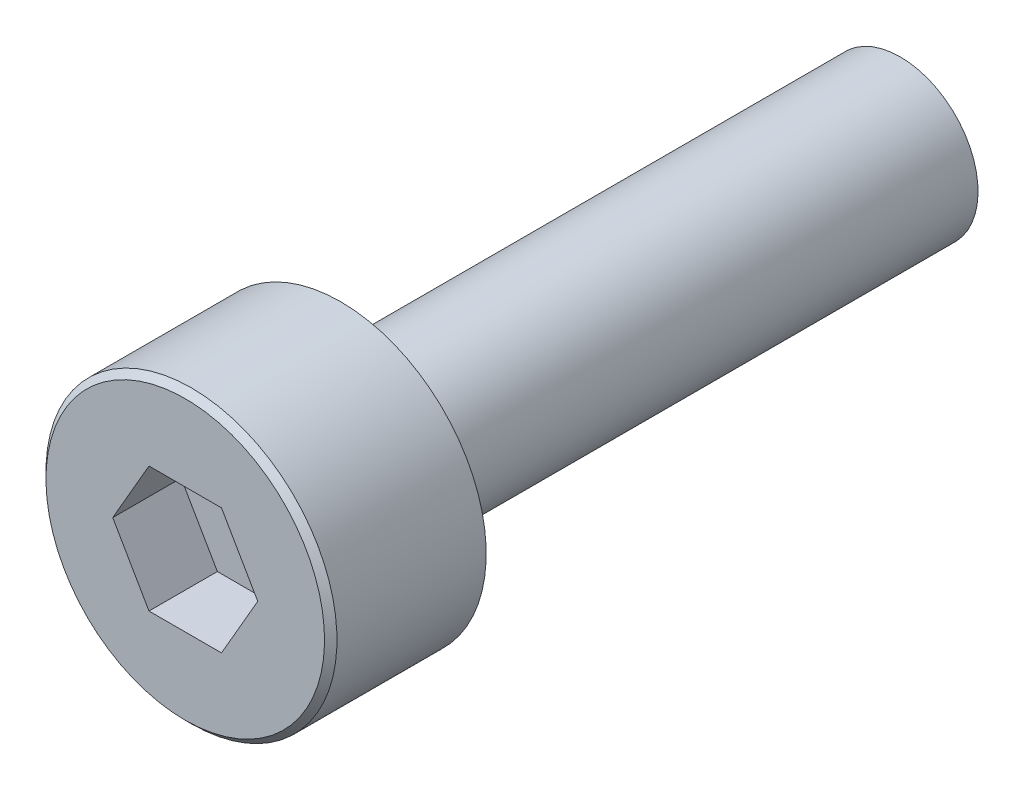
ISO-10303-21;
HEADER;
FILE_DESCRIPTION(('STEP AP214'),'2;1');
FILE_NAME('part.step','',(''),(''),'','','');
FILE_SCHEMA(('AUTOMOTIVE_DESIGN { 1 0 10303 214 1 1 1 1 }'));
ENDSEC;
DATA;
#1=APPLICATION_CONTEXT('core data for automotive mechanical design processes');
#2=APPLICATION_PROTOCOL_DEFINITION('international standard','automotive_design',2000,#1);
#3=PRODUCT_CONTEXT('',#1,'mechanical');
#4=PRODUCT('Part','Part','',(#3));
#5=PRODUCT_RELATED_PRODUCT_CATEGORY('part','',(#4));
#6=PRODUCT_DEFINITION_FORMATION('','',#4);
#7=PRODUCT_DEFINITION_CONTEXT('part definition',#1,'design');
#8=PRODUCT_DEFINITION('design','',#6,#7);
#9=PRODUCT_DEFINITION_SHAPE('','',#8);
#10=(LENGTH_UNIT() NAMED_UNIT(*) SI_UNIT(.MILLI.,.METRE.));
#11=(NAMED_UNIT(*) PLANE_ANGLE_UNIT() SI_UNIT($,.RADIAN.));
#12=(NAMED_UNIT(*) SI_UNIT($,.STERADIAN.) SOLID_ANGLE_UNIT());
#13=UNCERTAINTY_MEASURE_WITH_UNIT(LENGTH_MEASURE(1.E-05),#10,'distance_accuracy_value','');
#14=(GEOMETRIC_REPRESENTATION_CONTEXT(3) GLOBAL_UNCERTAINTY_ASSIGNED_CONTEXT((#13)) GLOBAL_UNIT_ASSIGNED_CONTEXT((#10,
#11,#12)) REPRESENTATION_CONTEXT('',''));
#15=CARTESIAN_POINT('',(0.,0.,0.));
#16=DIRECTION('',(0.,0.,1.));
#17=DIRECTION('',(1.,0.,0.));
#18=AXIS2_PLACEMENT_3D('',#15,#16,#17);
#19=CARTESIAN_POINT('',(0.,0.,0.));
#20=DIRECTION('',(0.,0.,1.));
#21=DIRECTION('',(0.,-1.,0.));
#22=AXIS2_PLACEMENT_3D('',#19,#20,#21);
#23=PLANE('',#22);
#24=CARTESIAN_POINT('',(0.,0.,0.));
#25=DIRECTION('',(0.,0.,1.));
#26=DIRECTION('',(0.,-1.,0.));
#27=AXIS2_PLACEMENT_3D('',#24,#25,#26);
#28=CIRCLE('',#27,2.24);
#29=CARTESIAN_POINT('',(0.,-2.24,0.));
#30=VERTEX_POINT('',#29);
#31=EDGE_CURVE('E11',#30,#30,#28,.T.);
#32=ORIENTED_EDGE('',*,*,#31,.T.);
#33=EDGE_LOOP('',(#32));
#34=FACE_BOUND('',#33,.T.);
#35=DIRECTION('',(-0.5,0.866025403784439,0.));
#36=VECTOR('',#35,1.);
#37=CARTESIAN_POINT('',(1.16624754376304,0.,0.));
#38=LINE('',#37,#36);
#39=CARTESIAN_POINT('',(1.16624754376304,0.,0.));
#40=VERTEX_POINT('',#39);
#41=CARTESIAN_POINT('',(0.583123771881522,1.01,0.));
#42=VERTEX_POINT('',#41);
#43=EDGE_CURVE('E56',#40,#42,#38,.T.);
#44=ORIENTED_EDGE('',*,*,#43,.F.);
#45=DIRECTION('',(0.5,0.866025403784439,0.));
#46=VECTOR('',#45,1.);
#47=CARTESIAN_POINT('',(0.583123771881522,-1.01,0.));
#48=LINE('',#47,#46);
#49=CARTESIAN_POINT('',(0.583123771881522,-1.01,0.));
#50=VERTEX_POINT('',#49);
#51=EDGE_CURVE('E139',#50,#40,#48,.T.);
#52=ORIENTED_EDGE('',*,*,#51,.F.);
#53=DIRECTION('',(1.,0.,0.));
#54=VECTOR('',#53,1.);
#55=CARTESIAN_POINT('',(-0.583123771881522,-1.01,0.));
#56=LINE('',#55,#54);
#57=CARTESIAN_POINT('',(-0.583123771881522,-1.01,0.));
#58=VERTEX_POINT('',#57);
#59=EDGE_CURVE('E137',#58,#50,#56,.T.);
#60=ORIENTED_EDGE('',*,*,#59,.F.);
#61=DIRECTION('',(0.5,-0.866025403784439,0.));
#62=VECTOR('',#61,1.);
#63=CARTESIAN_POINT('',(-1.16624754376304,0.,0.));
#64=LINE('',#63,#62);
#65=CARTESIAN_POINT('',(-1.16624754376304,0.,0.));
#66=VERTEX_POINT('',#65);
#67=EDGE_CURVE('E104',#66,#58,#64,.T.);
#68=ORIENTED_EDGE('',*,*,#67,.F.);
#69=DIRECTION('',(-0.5,-0.866025403784439,0.));
#70=VECTOR('',#69,1.);
#71=CARTESIAN_POINT('',(-0.583123771881522,1.01,0.));
#72=LINE('',#71,#70);
#73=CARTESIAN_POINT('',(-0.583123771881522,1.01,0.));
#74=VERTEX_POINT('',#73);
#75=EDGE_CURVE('E133',#74,#66,#72,.T.);
#76=ORIENTED_EDGE('',*,*,#75,.F.);
#77=DIRECTION('',(-1.,0.,0.));
#78=VECTOR('',#77,1.);
#79=CARTESIAN_POINT('',(0.583123771881522,1.01,0.));
#80=LINE('',#79,#78);
#81=EDGE_CURVE('E130',#42,#74,#80,.T.);
#82=ORIENTED_EDGE('',*,*,#81,.F.);
#83=EDGE_LOOP('',(#44,#52,#60,#68,#76,#82));
#84=FACE_BOUND('',#83,.T.);
#85=ADVANCED_FACE('F40',(#34,#84),#23,.T.);
#86=CARTESIAN_POINT('',(0.,0.,-11.5));
#87=DIRECTION('',(0.,0.,-1.));
#88=DIRECTION('',(0.,1.,0.));
#89=AXIS2_PLACEMENT_3D('',#86,#87,#88);
#90=CYLINDRICAL_SURFACE('',#89,2.34);
#91=CARTESIAN_POINT('',(0.,0.,-0.0999999999999977));
#92=DIRECTION('',(0.,0.,1.));
#93=DIRECTION('',(0.,-1.,0.));
#94=AXIS2_PLACEMENT_3D('',#91,#92,#93);
#95=CIRCLE('',#94,2.34);
#96=CARTESIAN_POINT('',(0.,-2.34,-0.0999999999999979));
#97=VERTEX_POINT('',#96);
#98=EDGE_CURVE('E49',#97,#97,#95,.F.);
#99=ORIENTED_EDGE('',*,*,#98,.T.);
#100=EDGE_LOOP('',(#99));
#101=FACE_BOUND('',#100,.T.);
#102=CARTESIAN_POINT('',(0.,0.,-2.5));
#103=DIRECTION('',(0.,0.,-1.));
#104=DIRECTION('',(0.,1.,0.));
#105=AXIS2_PLACEMENT_3D('',#102,#103,#104);
#106=CIRCLE('',#105,2.34);
#107=CARTESIAN_POINT('',(0.,2.34,-2.5));
#108=VERTEX_POINT('',#107);
#109=EDGE_CURVE('E154',#108,#108,#106,.T.);
#110=ORIENTED_EDGE('',*,*,#109,.F.);
#111=EDGE_LOOP('',(#110));
#112=FACE_BOUND('',#111,.T.);
#113=ADVANCED_FACE('F159',(#101,#112),#90,.T.);
#114=CARTESIAN_POINT('',(0.,2.34,-2.5));
#115=DIRECTION('',(0.,0.,-1.));
#116=DIRECTION('',(0.,1.,0.));
#117=AXIS2_PLACEMENT_3D('',#114,#115,#116);
#118=PLANE('',#117);
#119=ORIENTED_EDGE('',*,*,#109,.T.);
#120=EDGE_LOOP('',(#119));
#121=FACE_BOUND('',#120,.T.);
#122=CARTESIAN_POINT('',(0.,0.,-2.5));
#123=DIRECTION('',(0.,0.,-1.));
#124=DIRECTION('',(0.,1.,0.));
#125=AXIS2_PLACEMENT_3D('',#122,#123,#124);
#126=CIRCLE('',#125,1.25);
#127=CARTESIAN_POINT('',(0.,1.25,-2.5));
#128=VERTEX_POINT('',#127);
#129=EDGE_CURVE('E151',#128,#128,#126,.T.);
#130=ORIENTED_EDGE('',*,*,#129,.F.);
#131=EDGE_LOOP('',(#130));
#132=FACE_BOUND('',#131,.T.);
#133=ADVANCED_FACE('F175',(#121,#132),#118,.T.);
#134=CARTESIAN_POINT('',(0.,0.,-11.5));
#135=DIRECTION('',(0.,0.,-1.));
#136=DIRECTION('',(0.,1.,0.));
#137=AXIS2_PLACEMENT_3D('',#134,#135,#136);
#138=CYLINDRICAL_SURFACE('',#137,1.25);
#139=ORIENTED_EDGE('',*,*,#129,.T.);
#140=EDGE_LOOP('',(#139));
#141=FACE_BOUND('',#140,.T.);
#142=CARTESIAN_POINT('',(0.,0.,-11.5));
#143=DIRECTION('',(0.,0.,-1.));
#144=DIRECTION('',(0.,1.,0.));
#145=AXIS2_PLACEMENT_3D('',#142,#143,#144);
#146=CIRCLE('',#145,1.25);
#147=CARTESIAN_POINT('',(0.,1.25,-11.5));
#148=VERTEX_POINT('',#147);
#149=EDGE_CURVE('E143',#148,#148,#146,.T.);
#150=ORIENTED_EDGE('',*,*,#149,.F.);
#151=EDGE_LOOP('',(#150));
#152=FACE_BOUND('',#151,.T.);
#153=ADVANCED_FACE('F181',(#141,#152),#138,.T.);
#154=CARTESIAN_POINT('',(0.,1.25,-11.5));
#155=DIRECTION('',(0.,0.,-1.));
#156=DIRECTION('',(0.,1.,0.));
#157=AXIS2_PLACEMENT_3D('',#154,#155,#156);
#158=PLANE('',#157);
#159=ORIENTED_EDGE('',*,*,#149,.T.);
#160=EDGE_LOOP('',(#159));
#161=FACE_BOUND('',#160,.T.);
#162=ADVANCED_FACE('F185',(#161),#158,.T.);
#163=CARTESIAN_POINT('',(1.16624754376304,0.,-1.1));
#164=DIRECTION('',(0.866025403784438,0.5,0.));
#165=DIRECTION('',(-0.5,0.866025403784438,0.));
#166=AXIS2_PLACEMENT_3D('',#163,#164,#165);
#167=PLANE('',#166);
#168=ORIENTED_EDGE('',*,*,#43,.T.);
#169=DIRECTION('',(0.,0.,1.));
#170=VECTOR('',#169,1.);
#171=CARTESIAN_POINT('',(0.583123771881522,1.01,-1.1));
#172=LINE('',#171,#170);
#173=CARTESIAN_POINT('',(0.583123771881522,1.01,-1.1));
#174=VERTEX_POINT('',#173);
#175=EDGE_CURVE('E86',#174,#42,#172,.T.);
#176=ORIENTED_EDGE('',*,*,#175,.F.);
#177=DIRECTION('',(-0.5,0.866025403784439,0.));
#178=VECTOR('',#177,1.);
#179=CARTESIAN_POINT('',(1.16624754376304,0.,-1.1));
#180=LINE('',#179,#178);
#181=CARTESIAN_POINT('',(1.16624754376304,0.,-1.1));
#182=VERTEX_POINT('',#181);
#183=EDGE_CURVE('E141',#182,#174,#180,.T.);
#184=ORIENTED_EDGE('',*,*,#183,.F.);
#185=DIRECTION('',(0.,0.,1.));
#186=VECTOR('',#185,1.);
#187=CARTESIAN_POINT('',(1.16624754376304,0.,-1.1));
#188=LINE('',#187,#186);
#189=EDGE_CURVE('E64',#182,#40,#188,.T.);
#190=ORIENTED_EDGE('',*,*,#189,.T.);
#191=EDGE_LOOP('',(#168,#176,#184,#190));
#192=FACE_BOUND('',#191,.T.);
#193=ADVANCED_FACE('F189',(#192),#167,.F.);
#194=CARTESIAN_POINT('',(0.583123771881522,-1.01,-1.1));
#195=DIRECTION('',(0.866025403784438,-0.5,0.));
#196=DIRECTION('',(0.5,0.866025403784439,0.));
#197=AXIS2_PLACEMENT_3D('',#194,#195,#196);
#198=PLANE('',#197);
#199=ORIENTED_EDGE('',*,*,#51,.T.);
#200=ORIENTED_EDGE('',*,*,#189,.F.);
#201=DIRECTION('',(0.5,0.866025403784439,0.));
#202=VECTOR('',#201,1.);
#203=CARTESIAN_POINT('',(0.583123771881522,-1.01,-1.1));
#204=LINE('',#203,#202);
#205=CARTESIAN_POINT('',(0.583123771881522,-1.01,-1.1));
#206=VERTEX_POINT('',#205);
#207=EDGE_CURVE('E116',#206,#182,#204,.T.);
#208=ORIENTED_EDGE('',*,*,#207,.F.);
#209=DIRECTION('',(0.,0.,1.));
#210=VECTOR('',#209,1.);
#211=CARTESIAN_POINT('',(0.583123771881522,-1.01,-1.1));
#212=LINE('',#211,#210);
#213=EDGE_CURVE('E108',#206,#50,#212,.T.);
#214=ORIENTED_EDGE('',*,*,#213,.T.);
#215=EDGE_LOOP('',(#199,#200,#208,#214));
#216=FACE_BOUND('',#215,.T.);
#217=ADVANCED_FACE('F193',(#216),#198,.F.);
#218=CARTESIAN_POINT('',(-0.583123771881522,-1.01,-1.1));
#219=DIRECTION('',(0.,-1.,0.));
#220=DIRECTION('',(0.,0.,-1.));
#221=AXIS2_PLACEMENT_3D('',#218,#219,#220);
#222=PLANE('',#221);
#223=ORIENTED_EDGE('',*,*,#59,.T.);
#224=ORIENTED_EDGE('',*,*,#213,.F.);
#225=DIRECTION('',(1.,0.,0.));
#226=VECTOR('',#225,1.);
#227=CARTESIAN_POINT('',(-0.583123771881522,-1.01,-1.1));
#228=LINE('',#227,#226);
#229=CARTESIAN_POINT('',(-0.583123771881522,-1.01,-1.1));
#230=VERTEX_POINT('',#229);
#231=EDGE_CURVE('E112',#230,#206,#228,.T.);
#232=ORIENTED_EDGE('',*,*,#231,.F.);
#233=DIRECTION('',(0.,0.,1.));
#234=VECTOR('',#233,1.);
#235=CARTESIAN_POINT('',(-0.583123771881522,-1.01,-1.1));
#236=LINE('',#235,#234);
#237=EDGE_CURVE('E97',#230,#58,#236,.T.);
#238=ORIENTED_EDGE('',*,*,#237,.T.);
#239=EDGE_LOOP('',(#223,#224,#232,#238));
#240=FACE_BOUND('',#239,.T.);
#241=ADVANCED_FACE('F113',(#240),#222,.F.);
#242=CARTESIAN_POINT('',(-1.16624754376304,0.,-1.1));
#243=DIRECTION('',(-0.866025403784438,-0.5,0.));
#244=DIRECTION('',(0.5,-0.866025403784439,0.));
#245=AXIS2_PLACEMENT_3D('',#242,#243,#244);
#246=PLANE('',#245);
#247=ORIENTED_EDGE('',*,*,#67,.T.);
#248=ORIENTED_EDGE('',*,*,#237,.F.);
#249=DIRECTION('',(0.5,-0.866025403784439,0.));
#250=VECTOR('',#249,1.);
#251=CARTESIAN_POINT('',(-1.16624754376304,0.,-1.1));
#252=LINE('',#251,#250);
#253=CARTESIAN_POINT('',(-1.16624754376304,0.,-1.1));
#254=VERTEX_POINT('',#253);
#255=EDGE_CURVE('E101',#254,#230,#252,.T.);
#256=ORIENTED_EDGE('',*,*,#255,.F.);
#257=DIRECTION('',(0.,0.,1.));
#258=VECTOR('',#257,1.);
#259=CARTESIAN_POINT('',(-1.16624754376304,0.,-1.1));
#260=LINE('',#259,#258);
#261=EDGE_CURVE('E109',#254,#66,#260,.T.);
#262=ORIENTED_EDGE('',*,*,#261,.T.);
#263=EDGE_LOOP('',(#247,#248,#256,#262));
#264=FACE_BOUND('',#263,.T.);
#265=ADVANCED_FACE('F99',(#264),#246,.F.);
#266=CARTESIAN_POINT('',(-0.583123771881522,1.01,-1.1));
#267=DIRECTION('',(-0.866025403784438,0.5,0.));
#268=DIRECTION('',(-0.5,-0.866025403784439,0.));
#269=AXIS2_PLACEMENT_3D('',#266,#267,#268);
#270=PLANE('',#269);
#271=ORIENTED_EDGE('',*,*,#75,.T.);
#272=ORIENTED_EDGE('',*,*,#261,.F.);
#273=DIRECTION('',(-0.5,-0.866025403784439,0.));
#274=VECTOR('',#273,1.);
#275=CARTESIAN_POINT('',(-0.583123771881522,1.01,-1.1));
#276=LINE('',#275,#274);
#277=CARTESIAN_POINT('',(-0.583123771881522,1.01,-1.1));
#278=VERTEX_POINT('',#277);
#279=EDGE_CURVE('E122',#278,#254,#276,.T.);
#280=ORIENTED_EDGE('',*,*,#279,.F.);
#281=DIRECTION('',(0.,0.,1.));
#282=VECTOR('',#281,1.);
#283=CARTESIAN_POINT('',(-0.583123771881522,1.01,-1.1));
#284=LINE('',#283,#282);
#285=EDGE_CURVE('E146',#278,#74,#284,.T.);
#286=ORIENTED_EDGE('',*,*,#285,.T.);
#287=EDGE_LOOP('',(#271,#272,#280,#286));
#288=FACE_BOUND('',#287,.T.);
#289=ADVANCED_FACE('F196',(#288),#270,.F.);
#290=CARTESIAN_POINT('',(0.583123771881522,1.01,-1.1));
#291=DIRECTION('',(0.,1.,0.));
#292=DIRECTION('',(-1.,0.,0.));
#293=AXIS2_PLACEMENT_3D('',#290,#291,#292);
#294=PLANE('',#293);
#295=ORIENTED_EDGE('',*,*,#81,.T.);
#296=ORIENTED_EDGE('',*,*,#285,.F.);
#297=DIRECTION('',(-1.,0.,0.));
#298=VECTOR('',#297,1.);
#299=CARTESIAN_POINT('',(0.583123771881522,1.01,-1.1));
#300=LINE('',#299,#298);
#301=EDGE_CURVE('E124',#174,#278,#300,.T.);
#302=ORIENTED_EDGE('',*,*,#301,.F.);
#303=ORIENTED_EDGE('',*,*,#175,.T.);
#304=EDGE_LOOP('',(#295,#296,#302,#303));
#305=FACE_BOUND('',#304,.T.);
#306=ADVANCED_FACE('F167',(#305),#294,.F.);
#307=CARTESIAN_POINT('',(0.,0.,-1.1));
#308=DIRECTION('',(0.,0.,1.));
#309=DIRECTION('',(1.,0.,0.));
#310=AXIS2_PLACEMENT_3D('',#307,#308,#309);
#311=PLANE('',#310);
#312=ORIENTED_EDGE('',*,*,#183,.T.);
#313=ORIENTED_EDGE('',*,*,#301,.T.);
#314=ORIENTED_EDGE('',*,*,#279,.T.);
#315=ORIENTED_EDGE('',*,*,#255,.T.);
#316=ORIENTED_EDGE('',*,*,#231,.T.);
#317=ORIENTED_EDGE('',*,*,#207,.T.);
#318=EDGE_LOOP('',(#312,#313,#314,#315,#316,#317));
#319=FACE_BOUND('',#318,.T.);
#320=ADVANCED_FACE('F119',(#319),#311,.T.);
#321=CARTESIAN_POINT('',(0.,0.,-0.0999999999999977));
#322=DIRECTION('',(0.,0.,-1.));
#323=DIRECTION('',(0.,1.,0.));
#324=AXIS2_PLACEMENT_3D('',#321,#322,#323);
#325=CONICAL_SURFACE('',#324,2.34,0.785398163397446);
#326=ORIENTED_EDGE('',*,*,#31,.F.);
#327=EDGE_LOOP('',(#326));
#328=FACE_BOUND('',#327,.T.);
#329=ORIENTED_EDGE('',*,*,#98,.F.);
#330=EDGE_LOOP('',(#329));
#331=FACE_BOUND('',#330,.T.);
#332=ADVANCED_FACE('F43',(#328,#331),#325,.T.);
#333=CLOSED_SHELL('',(#85,#113,#133,#153,#162,#193,#217,#241,#265,#289,#306,#320,#332));
#334=MANIFOLD_SOLID_BREP('B2',#333);
#335=ADVANCED_BREP_SHAPE_REPRESENTATION('',(#18,#334),#14);
#336=SHAPE_DEFINITION_REPRESENTATION(#9,#335);
ENDSEC;
END-ISO-10303-21;
